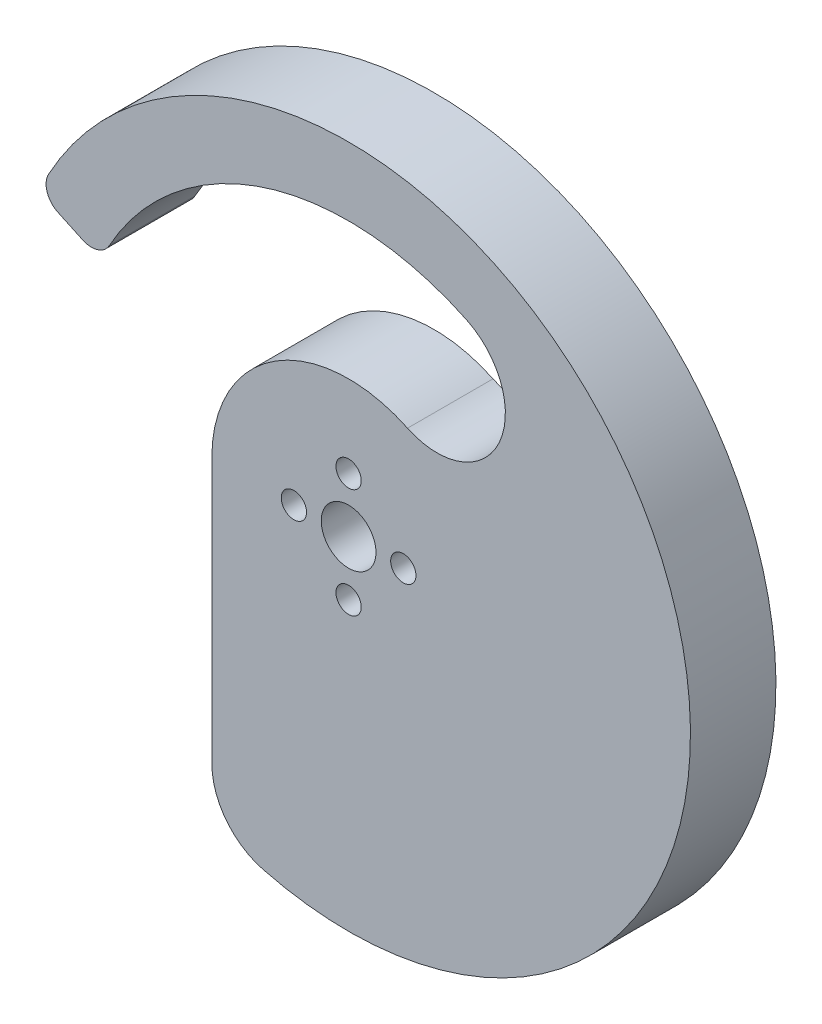
ISO-10303-21;
HEADER;
FILE_DESCRIPTION(('STEP AP214'),'2;1');
FILE_NAME('part.step','',(''),(''),'','','');
FILE_SCHEMA(('AUTOMOTIVE_DESIGN { 1 0 10303 214 1 1 1 1 }'));
ENDSEC;
DATA;
#1=APPLICATION_CONTEXT('core data for automotive mechanical design processes');
#2=APPLICATION_PROTOCOL_DEFINITION('international standard','automotive_design',2000,#1);
#3=PRODUCT_CONTEXT('',#1,'mechanical');
#4=PRODUCT('Part','Part','',(#3));
#5=PRODUCT_RELATED_PRODUCT_CATEGORY('part','',(#4));
#6=PRODUCT_DEFINITION_FORMATION('','',#4);
#7=PRODUCT_DEFINITION_CONTEXT('part definition',#1,'design');
#8=PRODUCT_DEFINITION('design','',#6,#7);
#9=PRODUCT_DEFINITION_SHAPE('','',#8);
#10=(LENGTH_UNIT() NAMED_UNIT(*) SI_UNIT(.MILLI.,.METRE.));
#11=(NAMED_UNIT(*) PLANE_ANGLE_UNIT() SI_UNIT($,.RADIAN.));
#12=(NAMED_UNIT(*) SI_UNIT($,.STERADIAN.) SOLID_ANGLE_UNIT());
#13=UNCERTAINTY_MEASURE_WITH_UNIT(LENGTH_MEASURE(1.E-05),#10,'distance_accuracy_value','');
#14=(GEOMETRIC_REPRESENTATION_CONTEXT(3) GLOBAL_UNCERTAINTY_ASSIGNED_CONTEXT((#13)) GLOBAL_UNIT_ASSIGNED_CONTEXT((#10,
#11,#12)) REPRESENTATION_CONTEXT('',''));
#15=CARTESIAN_POINT('',(0.,0.,0.));
#16=DIRECTION('',(0.,0.,1.));
#17=DIRECTION('',(1.,0.,0.));
#18=AXIS2_PLACEMENT_3D('',#15,#16,#17);
#19=CARTESIAN_POINT('',(0.,0.,12.5));
#20=DIRECTION('',(0.,0.,-1.));
#21=DIRECTION('',(-1.,0.,0.));
#22=AXIS2_PLACEMENT_3D('',#19,#20,#21);
#23=PLANE('',#22);
#24=DIRECTION('',(0.,-1.,0.));
#25=VECTOR('',#24,1.);
#26=CARTESIAN_POINT('',(-20.,0.,12.5));
#27=LINE('',#26,#25);
#28=CARTESIAN_POINT('',(-20.,0.,12.5));
#29=VERTEX_POINT('',#28);
#30=CARTESIAN_POINT('',(-20.,-38.7298334620741,12.5));
#31=VERTEX_POINT('',#30);
#32=EDGE_CURVE('E111',#29,#31,#27,.T.);
#33=ORIENTED_EDGE('',*,*,#32,.T.);
#34=CARTESIAN_POINT('',(-10.,-38.7298334620742,12.5));
#35=DIRECTION('',(0.,0.,-1.));
#36=DIRECTION('',(-1.,0.,0.));
#37=AXIS2_PLACEMENT_3D('',#34,#35,#36);
#38=CIRCLE('',#37,10.);
#39=CARTESIAN_POINT('',(-12.5,-48.4122918275927,12.5));
#40=VERTEX_POINT('',#39);
#41=EDGE_CURVE('E11',#31,#40,#38,.F.);
#42=ORIENTED_EDGE('',*,*,#41,.T.);
#43=CARTESIAN_POINT('',(0.,0.,12.5));
#44=DIRECTION('',(0.,0.,1.));
#45=DIRECTION('',(1.,0.,0.));
#46=AXIS2_PLACEMENT_3D('',#43,#44,#45);
#47=CIRCLE('',#46,50.);
#48=CARTESIAN_POINT('',(-43.8742005217573,23.9802945890293,12.5));
#49=VERTEX_POINT('',#48);
#50=EDGE_CURVE('E123',#40,#49,#47,.T.);
#51=ORIENTED_EDGE('',*,*,#50,.T.);
#52=CARTESIAN_POINT('',(-41.2417484904519,22.5414769136876,12.5));
#53=DIRECTION('',(0.,0.,-1.));
#54=DIRECTION('',(-1.,0.,0.));
#55=AXIS2_PLACEMENT_3D('',#52,#53,#54);
#56=CIRCLE('',#55,3.);
#57=CARTESIAN_POINT('',(-42.509603275674,19.8225535525776,12.5));
#58=VERTEX_POINT('',#57);
#59=EDGE_CURVE('E165',#49,#58,#56,.F.);
#60=ORIENTED_EDGE('',*,*,#59,.T.);
#61=DIRECTION('',(0.90630778703665,-0.4226182617407,0.));
#62=VECTOR('',#61,1.);
#63=CARTESIAN_POINT('',(-45.3153893518325,21.130913087035,12.5));
#64=LINE('',#63,#62);
#65=CARTESIAN_POINT('',(-38.8762729812364,18.1283038116748,12.5));
#66=VERTEX_POINT('',#65);
#67=EDGE_CURVE('E134',#58,#66,#64,.T.);
#68=ORIENTED_EDGE('',*,*,#67,.T.);
#69=CARTESIAN_POINT('',(-37.6084181960143,20.8472271727848,12.5));
#70=DIRECTION('',(0.,0.,-1.));
#71=DIRECTION('',(-1.,0.,0.));
#72=AXIS2_PLACEMENT_3D('',#69,#70,#71);
#73=CIRCLE('',#72,3.);
#74=CARTESIAN_POINT('',(-34.9845750660599,19.3927694630556,12.5));
#75=VERTEX_POINT('',#74);
#76=EDGE_CURVE('E167',#66,#75,#73,.F.);
#77=ORIENTED_EDGE('',*,*,#76,.T.);
#78=CARTESIAN_POINT('',(0.,0.,12.5));
#79=DIRECTION('',(0.,0.,-1.));
#80=DIRECTION('',(1.,0.,0.));
#81=AXIS2_PLACEMENT_3D('',#78,#79,#80);
#82=CIRCLE('',#81,40.);
#83=CARTESIAN_POINT('',(17.2385762508461,36.0947570824873,12.5));
#84=VERTEX_POINT('',#83);
#85=EDGE_CURVE('E129',#75,#84,#82,.T.);
#86=ORIENTED_EDGE('',*,*,#85,.T.);
#87=CARTESIAN_POINT('',(12.9289321881346,27.0710678118654,12.5));
#88=DIRECTION('',(0.,0.,-1.));
#89=DIRECTION('',(-1.,0.,0.));
#90=AXIS2_PLACEMENT_3D('',#87,#88,#89);
#91=CIRCLE('',#90,10.);
#92=CARTESIAN_POINT('',(20.0000000000001,20.,12.5));
#93=VERTEX_POINT('',#92);
#94=EDGE_CURVE('E143',#84,#93,#91,.T.);
#95=ORIENTED_EDGE('',*,*,#94,.T.);
#96=CARTESIAN_POINT('',(12.9289321881346,27.0710678118655,12.5));
#97=DIRECTION('',(0.,0.,-1.));
#98=DIRECTION('',(-1.,0.,0.));
#99=AXIS2_PLACEMENT_3D('',#96,#97,#98);
#100=CIRCLE('',#99,10.);
#101=CARTESIAN_POINT('',(8.61928812542306,18.0473785412436,12.5));
#102=VERTEX_POINT('',#101);
#103=EDGE_CURVE('E114',#93,#102,#100,.T.);
#104=ORIENTED_EDGE('',*,*,#103,.T.);
#105=CARTESIAN_POINT('',(0.,0.,12.5));
#106=DIRECTION('',(0.,0.,1.));
#107=DIRECTION('',(-1.,0.,0.));
#108=AXIS2_PLACEMENT_3D('',#105,#106,#107);
#109=CIRCLE('',#108,20.);
#110=EDGE_CURVE('E109',#102,#29,#109,.T.);
#111=ORIENTED_EDGE('',*,*,#110,.T.);
#112=EDGE_LOOP('',(#33,#42,#51,#60,#68,#77,#86,#95,#104,#111));
#113=FACE_BOUND('',#112,.T.);
#114=CARTESIAN_POINT('',(0.,0.,12.5));
#115=DIRECTION('',(0.,0.,1.));
#116=DIRECTION('',(1.,0.,0.));
#117=AXIS2_PLACEMENT_3D('',#114,#115,#116);
#118=CIRCLE('',#117,4.);
#119=CARTESIAN_POINT('',(4.,0.,12.5));
#120=VERTEX_POINT('',#119);
#121=EDGE_CURVE('E191',#120,#120,#118,.T.);
#122=ORIENTED_EDGE('',*,*,#121,.F.);
#123=EDGE_LOOP('',(#122));
#124=FACE_BOUND('',#123,.T.);
#125=CARTESIAN_POINT('',(0.,8.,12.5));
#126=DIRECTION('',(0.,0.,1.));
#127=DIRECTION('',(1.,0.,0.));
#128=AXIS2_PLACEMENT_3D('',#125,#126,#127);
#129=CIRCLE('',#128,1.85);
#130=CARTESIAN_POINT('',(1.85,8.,12.5));
#131=VERTEX_POINT('',#130);
#132=EDGE_CURVE('E199',#131,#131,#129,.T.);
#133=ORIENTED_EDGE('',*,*,#132,.F.);
#134=EDGE_LOOP('',(#133));
#135=FACE_BOUND('',#134,.T.);
#136=CARTESIAN_POINT('',(8.,0.,12.5));
#137=DIRECTION('',(0.,0.,1.));
#138=DIRECTION('',(1.,0.,0.));
#139=AXIS2_PLACEMENT_3D('',#136,#137,#138);
#140=CIRCLE('',#139,1.85);
#141=CARTESIAN_POINT('',(9.85,0.,12.5));
#142=VERTEX_POINT('',#141);
#143=EDGE_CURVE('E205',#142,#142,#140,.T.);
#144=ORIENTED_EDGE('',*,*,#143,.F.);
#145=EDGE_LOOP('',(#144));
#146=FACE_BOUND('',#145,.T.);
#147=CARTESIAN_POINT('',(0.,-8.,12.5));
#148=DIRECTION('',(0.,0.,1.));
#149=DIRECTION('',(1.,0.,0.));
#150=AXIS2_PLACEMENT_3D('',#147,#148,#149);
#151=CIRCLE('',#150,1.85);
#152=CARTESIAN_POINT('',(1.84999999999994,-8.,12.5));
#153=VERTEX_POINT('',#152);
#154=EDGE_CURVE('E211',#153,#153,#151,.T.);
#155=ORIENTED_EDGE('',*,*,#154,.F.);
#156=EDGE_LOOP('',(#155));
#157=FACE_BOUND('',#156,.T.);
#158=CARTESIAN_POINT('',(-8.,0.,12.5));
#159=DIRECTION('',(0.,0.,1.));
#160=DIRECTION('',(1.,0.,0.));
#161=AXIS2_PLACEMENT_3D('',#158,#159,#160);
#162=CIRCLE('',#161,1.85);
#163=CARTESIAN_POINT('',(-6.15,0.,12.5));
#164=VERTEX_POINT('',#163);
#165=EDGE_CURVE('E217',#164,#164,#162,.T.);
#166=ORIENTED_EDGE('',*,*,#165,.F.);
#167=EDGE_LOOP('',(#166));
#168=FACE_BOUND('',#167,.T.);
#169=ADVANCED_FACE('F33',(#113,#124,#135,#146,#157,#168),#23,.F.);
#170=CARTESIAN_POINT('',(0.,0.,0.));
#171=DIRECTION('',(0.,0.,-1.));
#172=DIRECTION('',(-1.,0.,0.));
#173=AXIS2_PLACEMENT_3D('',#170,#171,#172);
#174=PLANE('',#173);
#175=CARTESIAN_POINT('',(0.,-8.,0.));
#176=DIRECTION('',(0.,0.,1.));
#177=DIRECTION('',(1.,0.,0.));
#178=AXIS2_PLACEMENT_3D('',#175,#176,#177);
#179=CIRCLE('',#178,1.85);
#180=CARTESIAN_POINT('',(1.84999999999994,-8.,0.));
#181=VERTEX_POINT('',#180);
#182=EDGE_CURVE('E214',#181,#181,#179,.T.);
#183=ORIENTED_EDGE('',*,*,#182,.T.);
#184=EDGE_LOOP('',(#183));
#185=FACE_BOUND('',#184,.T.);
#186=CARTESIAN_POINT('',(0.,8.,0.));
#187=DIRECTION('',(0.,0.,1.));
#188=DIRECTION('',(1.,0.,0.));
#189=AXIS2_PLACEMENT_3D('',#186,#187,#188);
#190=CIRCLE('',#189,1.85);
#191=CARTESIAN_POINT('',(1.85,8.,0.));
#192=VERTEX_POINT('',#191);
#193=EDGE_CURVE('E202',#192,#192,#190,.T.);
#194=ORIENTED_EDGE('',*,*,#193,.T.);
#195=EDGE_LOOP('',(#194));
#196=FACE_BOUND('',#195,.T.);
#197=CARTESIAN_POINT('',(0.,0.,0.));
#198=DIRECTION('',(0.,0.,1.));
#199=DIRECTION('',(1.,0.,0.));
#200=AXIS2_PLACEMENT_3D('',#197,#198,#199);
#201=CIRCLE('',#200,50.);
#202=CARTESIAN_POINT('',(-12.5,-48.4122918275927,0.));
#203=VERTEX_POINT('',#202);
#204=CARTESIAN_POINT('',(-43.8742005217573,23.9802945890293,0.));
#205=VERTEX_POINT('',#204);
#206=EDGE_CURVE('E179',#203,#205,#201,.T.);
#207=ORIENTED_EDGE('',*,*,#206,.F.);
#208=CARTESIAN_POINT('',(-10.,-38.7298334620742,0.));
#209=DIRECTION('',(0.,0.,-1.));
#210=DIRECTION('',(-1.,0.,0.));
#211=AXIS2_PLACEMENT_3D('',#208,#209,#210);
#212=CIRCLE('',#211,10.);
#213=CARTESIAN_POINT('',(-20.,-38.7298334620741,0.));
#214=VERTEX_POINT('',#213);
#215=EDGE_CURVE('E55',#203,#214,#212,.T.);
#216=ORIENTED_EDGE('',*,*,#215,.T.);
#217=DIRECTION('',(0.,-1.,0.));
#218=VECTOR('',#217,1.);
#219=CARTESIAN_POINT('',(-20.,0.,0.));
#220=LINE('',#219,#218);
#221=CARTESIAN_POINT('',(-20.,0.,0.));
#222=VERTEX_POINT('',#221);
#223=EDGE_CURVE('E186',#222,#214,#220,.T.);
#224=ORIENTED_EDGE('',*,*,#223,.F.);
#225=CARTESIAN_POINT('',(0.,0.,0.));
#226=DIRECTION('',(0.,0.,1.));
#227=DIRECTION('',(-1.,0.,0.));
#228=AXIS2_PLACEMENT_3D('',#225,#226,#227);
#229=CIRCLE('',#228,20.);
#230=CARTESIAN_POINT('',(8.61928812542306,18.0473785412436,0.));
#231=VERTEX_POINT('',#230);
#232=EDGE_CURVE('E127',#231,#222,#229,.T.);
#233=ORIENTED_EDGE('',*,*,#232,.F.);
#234=CARTESIAN_POINT('',(12.9289321881346,27.0710678118655,0.));
#235=DIRECTION('',(0.,0.,-1.));
#236=DIRECTION('',(-1.,0.,0.));
#237=AXIS2_PLACEMENT_3D('',#234,#235,#236);
#238=CIRCLE('',#237,10.);
#239=CARTESIAN_POINT('',(20.0000000000001,20.,0.));
#240=VERTEX_POINT('',#239);
#241=EDGE_CURVE('E145',#231,#240,#238,.F.);
#242=ORIENTED_EDGE('',*,*,#241,.T.);
#243=CARTESIAN_POINT('',(12.9289321881346,27.0710678118654,0.));
#244=DIRECTION('',(0.,0.,-1.));
#245=DIRECTION('',(-1.,0.,0.));
#246=AXIS2_PLACEMENT_3D('',#243,#244,#245);
#247=CIRCLE('',#246,10.);
#248=CARTESIAN_POINT('',(17.2385762508461,36.0947570824873,0.));
#249=VERTEX_POINT('',#248);
#250=EDGE_CURVE('E140',#240,#249,#247,.F.);
#251=ORIENTED_EDGE('',*,*,#250,.T.);
#252=CARTESIAN_POINT('',(0.,0.,0.));
#253=DIRECTION('',(0.,0.,-1.));
#254=DIRECTION('',(1.,0.,0.));
#255=AXIS2_PLACEMENT_3D('',#252,#253,#254);
#256=CIRCLE('',#255,40.);
#257=CARTESIAN_POINT('',(-34.9845750660599,19.3927694630556,0.));
#258=VERTEX_POINT('',#257);
#259=EDGE_CURVE('E118',#258,#249,#256,.T.);
#260=ORIENTED_EDGE('',*,*,#259,.F.);
#261=CARTESIAN_POINT('',(-37.6084181960143,20.8472271727848,0.));
#262=DIRECTION('',(0.,0.,-1.));
#263=DIRECTION('',(-1.,0.,0.));
#264=AXIS2_PLACEMENT_3D('',#261,#262,#263);
#265=CIRCLE('',#264,3.);
#266=CARTESIAN_POINT('',(-38.8762729812364,18.1283038116748,0.));
#267=VERTEX_POINT('',#266);
#268=EDGE_CURVE('E158',#258,#267,#265,.T.);
#269=ORIENTED_EDGE('',*,*,#268,.T.);
#270=DIRECTION('',(0.90630778703665,-0.4226182617407,0.));
#271=VECTOR('',#270,1.);
#272=CARTESIAN_POINT('',(-45.3153893518325,21.130913087035,0.));
#273=LINE('',#272,#271);
#274=CARTESIAN_POINT('',(-42.509603275674,19.8225535525776,0.));
#275=VERTEX_POINT('',#274);
#276=EDGE_CURVE('E185',#275,#267,#273,.T.);
#277=ORIENTED_EDGE('',*,*,#276,.F.);
#278=CARTESIAN_POINT('',(-41.2417484904519,22.5414769136876,0.));
#279=DIRECTION('',(0.,0.,-1.));
#280=DIRECTION('',(-1.,0.,0.));
#281=AXIS2_PLACEMENT_3D('',#278,#279,#280);
#282=CIRCLE('',#281,3.);
#283=EDGE_CURVE('E155',#275,#205,#282,.T.);
#284=ORIENTED_EDGE('',*,*,#283,.T.);
#285=EDGE_LOOP('',(#207,#216,#224,#233,#242,#251,#260,#269,#277,#284));
#286=FACE_BOUND('',#285,.T.);
#287=CARTESIAN_POINT('',(0.,0.,0.));
#288=DIRECTION('',(0.,0.,1.));
#289=DIRECTION('',(1.,0.,0.));
#290=AXIS2_PLACEMENT_3D('',#287,#288,#289);
#291=CIRCLE('',#290,4.);
#292=CARTESIAN_POINT('',(4.,0.,0.));
#293=VERTEX_POINT('',#292);
#294=EDGE_CURVE('E196',#293,#293,#291,.T.);
#295=ORIENTED_EDGE('',*,*,#294,.T.);
#296=EDGE_LOOP('',(#295));
#297=FACE_BOUND('',#296,.T.);
#298=CARTESIAN_POINT('',(8.,0.,0.));
#299=DIRECTION('',(0.,0.,1.));
#300=DIRECTION('',(1.,0.,0.));
#301=AXIS2_PLACEMENT_3D('',#298,#299,#300);
#302=CIRCLE('',#301,1.85);
#303=CARTESIAN_POINT('',(9.85,0.,0.));
#304=VERTEX_POINT('',#303);
#305=EDGE_CURVE('E208',#304,#304,#302,.T.);
#306=ORIENTED_EDGE('',*,*,#305,.T.);
#307=EDGE_LOOP('',(#306));
#308=FACE_BOUND('',#307,.T.);
#309=CARTESIAN_POINT('',(-8.,0.,0.));
#310=DIRECTION('',(0.,0.,1.));
#311=DIRECTION('',(1.,0.,0.));
#312=AXIS2_PLACEMENT_3D('',#309,#310,#311);
#313=CIRCLE('',#312,1.85);
#314=CARTESIAN_POINT('',(-6.15,0.,0.));
#315=VERTEX_POINT('',#314);
#316=EDGE_CURVE('E152',#315,#315,#313,.T.);
#317=ORIENTED_EDGE('',*,*,#316,.T.);
#318=EDGE_LOOP('',(#317));
#319=FACE_BOUND('',#318,.T.);
#320=ADVANCED_FACE('F181',(#185,#196,#286,#297,#308,#319),#174,.T.);
#321=CARTESIAN_POINT('',(0.,0.,12.5));
#322=DIRECTION('',(0.,0.,-1.));
#323=DIRECTION('',(-1.,0.,0.));
#324=AXIS2_PLACEMENT_3D('',#321,#322,#323);
#325=CYLINDRICAL_SURFACE('',#324,20.);
#326=ORIENTED_EDGE('',*,*,#110,.F.);
#327=DIRECTION('',(0.,0.,-1.));
#328=VECTOR('',#327,1.);
#329=CARTESIAN_POINT('',(8.61928812542306,18.0473785412436,12.5));
#330=LINE('',#329,#328);
#331=EDGE_CURVE('E132',#102,#231,#330,.T.);
#332=ORIENTED_EDGE('',*,*,#331,.T.);
#333=ORIENTED_EDGE('',*,*,#232,.T.);
#334=DIRECTION('',(0.,0.,-1.));
#335=VECTOR('',#334,1.);
#336=CARTESIAN_POINT('',(-20.,0.,12.5));
#337=LINE('',#336,#335);
#338=EDGE_CURVE('E122',#29,#222,#337,.T.);
#339=ORIENTED_EDGE('',*,*,#338,.F.);
#340=EDGE_LOOP('',(#326,#332,#333,#339));
#341=FACE_BOUND('',#340,.T.);
#342=ADVANCED_FACE('F125',(#341),#325,.T.);
#343=CARTESIAN_POINT('',(-20.,0.,12.5));
#344=DIRECTION('',(1.,0.,0.));
#345=DIRECTION('',(0.,0.,-1.));
#346=AXIS2_PLACEMENT_3D('',#343,#344,#345);
#347=PLANE('',#346);
#348=ORIENTED_EDGE('',*,*,#223,.T.);
#349=DIRECTION('',(0.,0.,-1.));
#350=VECTOR('',#349,1.);
#351=CARTESIAN_POINT('',(-20.,-38.7298334620742,12.5));
#352=LINE('',#351,#350);
#353=EDGE_CURVE('E41',#214,#31,#352,.F.);
#354=ORIENTED_EDGE('',*,*,#353,.T.);
#355=ORIENTED_EDGE('',*,*,#32,.F.);
#356=ORIENTED_EDGE('',*,*,#338,.T.);
#357=EDGE_LOOP('',(#348,#354,#355,#356));
#358=FACE_BOUND('',#357,.T.);
#359=ADVANCED_FACE('F121',(#358),#347,.F.);
#360=CARTESIAN_POINT('',(0.,0.,12.5));
#361=DIRECTION('',(0.,0.,-1.));
#362=DIRECTION('',(-1.,0.,0.));
#363=AXIS2_PLACEMENT_3D('',#360,#361,#362);
#364=CYLINDRICAL_SURFACE('',#363,50.);
#365=ORIENTED_EDGE('',*,*,#50,.F.);
#366=DIRECTION('',(0.,0.,-1.));
#367=VECTOR('',#366,1.);
#368=CARTESIAN_POINT('',(-12.5,-48.4122918275927,12.5));
#369=LINE('',#368,#367);
#370=EDGE_CURVE('E172',#40,#203,#369,.T.);
#371=ORIENTED_EDGE('',*,*,#370,.T.);
#372=ORIENTED_EDGE('',*,*,#206,.T.);
#373=DIRECTION('',(0.,0.,-1.));
#374=VECTOR('',#373,1.);
#375=CARTESIAN_POINT('',(-43.8742005217573,23.9802945890293,12.5));
#376=LINE('',#375,#374);
#377=EDGE_CURVE('E169',#205,#49,#376,.F.);
#378=ORIENTED_EDGE('',*,*,#377,.T.);
#379=EDGE_LOOP('',(#365,#371,#372,#378));
#380=FACE_BOUND('',#379,.T.);
#381=ADVANCED_FACE('F178',(#380),#364,.T.);
#382=CARTESIAN_POINT('',(-45.3153893518325,21.130913087035,12.5));
#383=DIRECTION('',(0.4226182617407,0.90630778703665,0.));
#384=DIRECTION('',(-0.90630778703665,0.4226182617407,0.));
#385=AXIS2_PLACEMENT_3D('',#382,#383,#384);
#386=PLANE('',#385);
#387=ORIENTED_EDGE('',*,*,#276,.T.);
#388=DIRECTION('',(0.,0.,-1.));
#389=VECTOR('',#388,1.);
#390=CARTESIAN_POINT('',(-38.8762729812364,18.1283038116748,12.5));
#391=LINE('',#390,#389);
#392=EDGE_CURVE('E163',#267,#66,#391,.F.);
#393=ORIENTED_EDGE('',*,*,#392,.T.);
#394=ORIENTED_EDGE('',*,*,#67,.F.);
#395=DIRECTION('',(0.,0.,-1.));
#396=VECTOR('',#395,1.);
#397=CARTESIAN_POINT('',(-42.509603275674,19.8225535525776,12.5));
#398=LINE('',#397,#396);
#399=EDGE_CURVE('E160',#58,#275,#398,.T.);
#400=ORIENTED_EDGE('',*,*,#399,.T.);
#401=EDGE_LOOP('',(#387,#393,#394,#400));
#402=FACE_BOUND('',#401,.T.);
#403=ADVANCED_FACE('F242',(#402),#386,.F.);
#404=CARTESIAN_POINT('',(0.,0.,12.5));
#405=DIRECTION('',(0.,0.,-1.));
#406=DIRECTION('',(-1.,0.,0.));
#407=AXIS2_PLACEMENT_3D('',#404,#405,#406);
#408=CYLINDRICAL_SURFACE('',#407,40.);
#409=ORIENTED_EDGE('',*,*,#85,.F.);
#410=DIRECTION('',(0.,0.,-1.));
#411=VECTOR('',#410,1.);
#412=CARTESIAN_POINT('',(-34.9845750660599,19.3927694630556,12.5));
#413=LINE('',#412,#411);
#414=EDGE_CURVE('E148',#75,#258,#413,.T.);
#415=ORIENTED_EDGE('',*,*,#414,.T.);
#416=ORIENTED_EDGE('',*,*,#259,.T.);
#417=DIRECTION('',(0.,0.,-1.));
#418=VECTOR('',#417,1.);
#419=CARTESIAN_POINT('',(17.2385762508461,36.0947570824873,12.5));
#420=LINE('',#419,#418);
#421=EDGE_CURVE('E128',#249,#84,#420,.F.);
#422=ORIENTED_EDGE('',*,*,#421,.T.);
#423=EDGE_LOOP('',(#409,#415,#416,#422));
#424=FACE_BOUND('',#423,.T.);
#425=ADVANCED_FACE('F239',(#424),#408,.F.);
#426=CARTESIAN_POINT('',(0.,0.,12.5));
#427=DIRECTION('',(0.,0.,-1.));
#428=DIRECTION('',(-1.,0.,0.));
#429=AXIS2_PLACEMENT_3D('',#426,#427,#428);
#430=CYLINDRICAL_SURFACE('',#429,4.);
#431=ORIENTED_EDGE('',*,*,#121,.T.);
#432=EDGE_LOOP('',(#431));
#433=FACE_BOUND('',#432,.T.);
#434=ORIENTED_EDGE('',*,*,#294,.F.);
#435=EDGE_LOOP('',(#434));
#436=FACE_BOUND('',#435,.T.);
#437=ADVANCED_FACE('F236',(#433,#436),#430,.F.);
#438=CARTESIAN_POINT('',(0.,8.,12.5));
#439=DIRECTION('',(0.,0.,-1.));
#440=DIRECTION('',(-1.,0.,0.));
#441=AXIS2_PLACEMENT_3D('',#438,#439,#440);
#442=CYLINDRICAL_SURFACE('',#441,1.85);
#443=ORIENTED_EDGE('',*,*,#132,.T.);
#444=EDGE_LOOP('',(#443));
#445=FACE_BOUND('',#444,.T.);
#446=ORIENTED_EDGE('',*,*,#193,.F.);
#447=EDGE_LOOP('',(#446));
#448=FACE_BOUND('',#447,.T.);
#449=ADVANCED_FACE('F377',(#445,#448),#442,.F.);
#450=CARTESIAN_POINT('',(8.,0.,12.5));
#451=DIRECTION('',(0.,0.,-1.));
#452=DIRECTION('',(-1.,0.,0.));
#453=AXIS2_PLACEMENT_3D('',#450,#451,#452);
#454=CYLINDRICAL_SURFACE('',#453,1.85);
#455=ORIENTED_EDGE('',*,*,#143,.T.);
#456=EDGE_LOOP('',(#455));
#457=FACE_BOUND('',#456,.T.);
#458=ORIENTED_EDGE('',*,*,#305,.F.);
#459=EDGE_LOOP('',(#458));
#460=FACE_BOUND('',#459,.T.);
#461=ADVANCED_FACE('F367',(#457,#460),#454,.F.);
#462=CARTESIAN_POINT('',(0.,-8.,12.5));
#463=DIRECTION('',(0.,0.,-1.));
#464=DIRECTION('',(-1.,0.,0.));
#465=AXIS2_PLACEMENT_3D('',#462,#463,#464);
#466=CYLINDRICAL_SURFACE('',#465,1.85);
#467=ORIENTED_EDGE('',*,*,#154,.T.);
#468=EDGE_LOOP('',(#467));
#469=FACE_BOUND('',#468,.T.);
#470=ORIENTED_EDGE('',*,*,#182,.F.);
#471=EDGE_LOOP('',(#470));
#472=FACE_BOUND('',#471,.T.);
#473=ADVANCED_FACE('F358',(#469,#472),#466,.F.);
#474=CARTESIAN_POINT('',(-8.,0.,12.5));
#475=DIRECTION('',(0.,0.,-1.));
#476=DIRECTION('',(-1.,0.,0.));
#477=AXIS2_PLACEMENT_3D('',#474,#475,#476);
#478=CYLINDRICAL_SURFACE('',#477,1.85);
#479=ORIENTED_EDGE('',*,*,#165,.T.);
#480=EDGE_LOOP('',(#479));
#481=FACE_BOUND('',#480,.T.);
#482=ORIENTED_EDGE('',*,*,#316,.F.);
#483=EDGE_LOOP('',(#482));
#484=FACE_BOUND('',#483,.T.);
#485=ADVANCED_FACE('F225',(#481,#484),#478,.F.);
#486=CARTESIAN_POINT('',(12.9289321881346,27.0710678118655,12.5));
#487=DIRECTION('',(0.,0.,-1.));
#488=DIRECTION('',(-1.,0.,0.));
#489=AXIS2_PLACEMENT_3D('',#486,#487,#488);
#490=CYLINDRICAL_SURFACE('',#489,10.);
#491=ORIENTED_EDGE('',*,*,#331,.F.);
#492=ORIENTED_EDGE('',*,*,#103,.F.);
#493=DIRECTION('',(0.,0.,1.));
#494=VECTOR('',#493,1.);
#495=CARTESIAN_POINT('',(20.0000000000001,20.,12.5));
#496=LINE('',#495,#494);
#497=EDGE_CURVE('E149',#240,#93,#496,.T.);
#498=ORIENTED_EDGE('',*,*,#497,.F.);
#499=ORIENTED_EDGE('',*,*,#241,.F.);
#500=EDGE_LOOP('',(#491,#492,#498,#499));
#501=FACE_BOUND('',#500,.T.);
#502=ADVANCED_FACE('F257',(#501),#490,.F.);
#503=CARTESIAN_POINT('',(12.9289321881346,27.0710678118654,12.5));
#504=DIRECTION('',(0.,0.,-1.));
#505=DIRECTION('',(-1.,0.,0.));
#506=AXIS2_PLACEMENT_3D('',#503,#504,#505);
#507=CYLINDRICAL_SURFACE('',#506,10.);
#508=ORIENTED_EDGE('',*,*,#94,.F.);
#509=ORIENTED_EDGE('',*,*,#421,.F.);
#510=ORIENTED_EDGE('',*,*,#250,.F.);
#511=ORIENTED_EDGE('',*,*,#497,.T.);
#512=EDGE_LOOP('',(#508,#509,#510,#511));
#513=FACE_BOUND('',#512,.T.);
#514=ADVANCED_FACE('F253',(#513),#507,.F.);
#515=CARTESIAN_POINT('',(-37.6084181960143,20.8472271727848,12.5));
#516=DIRECTION('',(0.,0.,-1.));
#517=DIRECTION('',(-1.,0.,0.));
#518=AXIS2_PLACEMENT_3D('',#515,#516,#517);
#519=CYLINDRICAL_SURFACE('',#518,3.);
#520=ORIENTED_EDGE('',*,*,#76,.F.);
#521=ORIENTED_EDGE('',*,*,#392,.F.);
#522=ORIENTED_EDGE('',*,*,#268,.F.);
#523=ORIENTED_EDGE('',*,*,#414,.F.);
#524=EDGE_LOOP('',(#520,#521,#522,#523));
#525=FACE_BOUND('',#524,.T.);
#526=ADVANCED_FACE('F256',(#525),#519,.T.);
#527=CARTESIAN_POINT('',(-41.2417484904519,22.5414769136876,12.5));
#528=DIRECTION('',(0.,0.,-1.));
#529=DIRECTION('',(-1.,0.,0.));
#530=AXIS2_PLACEMENT_3D('',#527,#528,#529);
#531=CYLINDRICAL_SURFACE('',#530,3.);
#532=ORIENTED_EDGE('',*,*,#59,.F.);
#533=ORIENTED_EDGE('',*,*,#377,.F.);
#534=ORIENTED_EDGE('',*,*,#283,.F.);
#535=ORIENTED_EDGE('',*,*,#399,.F.);
#536=EDGE_LOOP('',(#532,#533,#534,#535));
#537=FACE_BOUND('',#536,.T.);
#538=ADVANCED_FACE('F263',(#537),#531,.T.);
#539=CARTESIAN_POINT('',(-10.,-38.7298334620742,12.5));
#540=DIRECTION('',(0.,0.,-1.));
#541=DIRECTION('',(-1.,0.,0.));
#542=AXIS2_PLACEMENT_3D('',#539,#540,#541);
#543=CYLINDRICAL_SURFACE('',#542,10.);
#544=ORIENTED_EDGE('',*,*,#41,.F.);
#545=ORIENTED_EDGE('',*,*,#353,.F.);
#546=ORIENTED_EDGE('',*,*,#215,.F.);
#547=ORIENTED_EDGE('',*,*,#370,.F.);
#548=EDGE_LOOP('',(#544,#545,#546,#547));
#549=FACE_BOUND('',#548,.T.);
#550=ADVANCED_FACE('F35',(#549),#543,.T.);
#551=CLOSED_SHELL('',(#169,#320,#342,#359,#381,#403,#425,#437,#449,#461,#473,#485,#502,#514,
#526,#538,#550));
#552=MANIFOLD_SOLID_BREP('B2',#551);
#553=ADVANCED_BREP_SHAPE_REPRESENTATION('',(#18,#552),#14);
#554=SHAPE_DEFINITION_REPRESENTATION(#9,#553);
ENDSEC;
END-ISO-10303-21;
